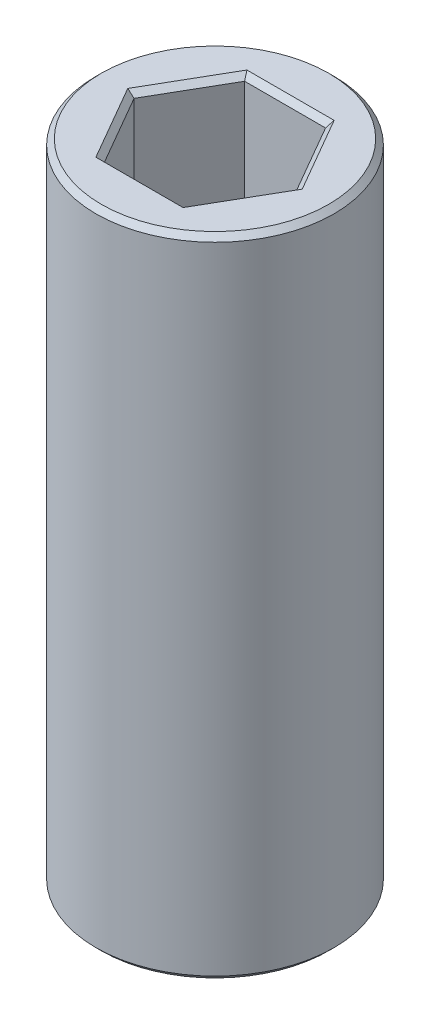
ISO-10303-21;
HEADER;
FILE_DESCRIPTION(('STEP AP214'),'2;1');
FILE_NAME('part.step','',(''),(''),'','','');
FILE_SCHEMA(('AUTOMOTIVE_DESIGN { 1 0 10303 214 1 1 1 1 }'));
ENDSEC;
DATA;
#1=APPLICATION_CONTEXT('core data for automotive mechanical design processes');
#2=APPLICATION_PROTOCOL_DEFINITION('international standard','automotive_design',2000,#1);
#3=PRODUCT_CONTEXT('',#1,'mechanical');
#4=PRODUCT('Part','Part','',(#3));
#5=PRODUCT_RELATED_PRODUCT_CATEGORY('part','',(#4));
#6=PRODUCT_DEFINITION_FORMATION('','',#4);
#7=PRODUCT_DEFINITION_CONTEXT('part definition',#1,'design');
#8=PRODUCT_DEFINITION('design','',#6,#7);
#9=PRODUCT_DEFINITION_SHAPE('','',#8);
#10=(LENGTH_UNIT() NAMED_UNIT(*) SI_UNIT(.MILLI.,.METRE.));
#11=(NAMED_UNIT(*) PLANE_ANGLE_UNIT() SI_UNIT($,.RADIAN.));
#12=(NAMED_UNIT(*) SI_UNIT($,.STERADIAN.) SOLID_ANGLE_UNIT());
#13=UNCERTAINTY_MEASURE_WITH_UNIT(LENGTH_MEASURE(1.E-05),#10,'distance_accuracy_value','');
#14=(GEOMETRIC_REPRESENTATION_CONTEXT(3) GLOBAL_UNCERTAINTY_ASSIGNED_CONTEXT((#13)) GLOBAL_UNIT_ASSIGNED_CONTEXT((#10,
#11,#12)) REPRESENTATION_CONTEXT('',''));
#15=CARTESIAN_POINT('',(0.,0.,0.));
#16=DIRECTION('',(0.,0.,1.));
#17=DIRECTION('',(1.,0.,0.));
#18=AXIS2_PLACEMENT_3D('',#15,#16,#17);
#19=CARTESIAN_POINT('',(0.,60.325,0.));
#20=DIRECTION('',(0.,1.,0.));
#21=DIRECTION('',(0.,0.,1.));
#22=AXIS2_PLACEMENT_3D('',#19,#20,#21);
#23=PLANE('',#22);
#24=CARTESIAN_POINT('',(0.,60.325,0.));
#25=DIRECTION('',(0.,1.,0.));
#26=DIRECTION('',(0.,0.,1.));
#27=AXIS2_PLACEMENT_3D('',#24,#25,#26);
#28=CIRCLE('',#27,10.6045);
#29=CARTESIAN_POINT('',(0.,60.325,10.6045));
#30=VERTEX_POINT('',#29);
#31=EDGE_CURVE('E11',#30,#30,#28,.T.);
#32=ORIENTED_EDGE('',*,*,#31,.T.);
#33=EDGE_LOOP('',(#32));
#34=FACE_BOUND('',#33,.T.);
#35=DIRECTION('',(-1.,0.,0.));
#36=VECTOR('',#35,1.);
#37=CARTESIAN_POINT('',(0.,60.325,7.0485));
#38=LINE('',#37,#36);
#39=CARTESIAN_POINT('',(4.06945337238308,60.325,7.0485));
#40=VERTEX_POINT('',#39);
#41=CARTESIAN_POINT('',(-4.06945337238308,60.325,7.04850000000001));
#42=VERTEX_POINT('',#41);
#43=EDGE_CURVE('E62',#40,#42,#38,.T.);
#44=ORIENTED_EDGE('',*,*,#43,.T.);
#45=DIRECTION('',(-0.5,0.,-0.866025403784439));
#46=VECTOR('',#45,1.);
#47=CARTESIAN_POINT('',(-6.10418005857462,60.325,3.52425));
#48=LINE('',#47,#46);
#49=CARTESIAN_POINT('',(-8.13890674476616,60.325,0.));
#50=VERTEX_POINT('',#49);
#51=EDGE_CURVE('E54',#42,#50,#48,.T.);
#52=ORIENTED_EDGE('',*,*,#51,.T.);
#53=DIRECTION('',(0.499999999999999,0.,-0.866025403784439));
#54=VECTOR('',#53,1.);
#55=CARTESIAN_POINT('',(-6.10418005857462,60.325,-3.52425));
#56=LINE('',#55,#54);
#57=CARTESIAN_POINT('',(-4.06945337238308,60.325,-7.0485));
#58=VERTEX_POINT('',#57);
#59=EDGE_CURVE('E230',#50,#58,#56,.T.);
#60=ORIENTED_EDGE('',*,*,#59,.T.);
#61=DIRECTION('',(1.,0.,0.));
#62=VECTOR('',#61,1.);
#63=CARTESIAN_POINT('',(0.,60.325,-7.0485));
#64=LINE('',#63,#62);
#65=CARTESIAN_POINT('',(4.06945337238308,60.325,-7.0485));
#66=VERTEX_POINT('',#65);
#67=EDGE_CURVE('E233',#58,#66,#64,.T.);
#68=ORIENTED_EDGE('',*,*,#67,.T.);
#69=DIRECTION('',(0.5,0.,0.866025403784439));
#70=VECTOR('',#69,1.);
#71=CARTESIAN_POINT('',(6.10418005857462,60.325,-3.52425));
#72=LINE('',#71,#70);
#73=CARTESIAN_POINT('',(8.13890674476616,60.325,0.));
#74=VERTEX_POINT('',#73);
#75=EDGE_CURVE('E236',#66,#74,#72,.T.);
#76=ORIENTED_EDGE('',*,*,#75,.T.);
#77=DIRECTION('',(-0.499999999999999,0.,0.866025403784439));
#78=VECTOR('',#77,1.);
#79=CARTESIAN_POINT('',(6.10418005857462,60.325,3.52425));
#80=LINE('',#79,#78);
#81=EDGE_CURVE('E67',#74,#40,#80,.T.);
#82=ORIENTED_EDGE('',*,*,#81,.T.);
#83=EDGE_LOOP('',(#44,#52,#60,#68,#76,#82));
#84=FACE_BOUND('',#83,.T.);
#85=ADVANCED_FACE('F43',(#34,#84),#23,.T.);
#86=CARTESIAN_POINT('',(0.,0.,0.));
#87=DIRECTION('',(0.,1.,0.));
#88=DIRECTION('',(0.,0.,1.));
#89=AXIS2_PLACEMENT_3D('',#86,#87,#88);
#90=PLANE('',#89);
#91=DIRECTION('',(-1.,0.,0.));
#92=VECTOR('',#91,1.);
#93=CARTESIAN_POINT('',(-3.77615943563475,0.,-7.0485));
#94=LINE('',#93,#92);
#95=CARTESIAN_POINT('',(4.06945337238308,0.,-7.0485));
#96=VERTEX_POINT('',#95);
#97=CARTESIAN_POINT('',(-4.06945337238308,0.,-7.0485));
#98=VERTEX_POINT('',#97);
#99=EDGE_CURVE('E141',#96,#98,#94,.T.);
#100=ORIENTED_EDGE('',*,*,#99,.T.);
#101=DIRECTION('',(-0.499999999999999,0.,0.866025403784439));
#102=VECTOR('',#101,1.);
#103=CARTESIAN_POINT('',(-7.99225977639199,0.,-0.253999999999998));
#104=LINE('',#103,#102);
#105=CARTESIAN_POINT('',(-8.13890674476615,0.,0.));
#106=VERTEX_POINT('',#105);
#107=EDGE_CURVE('E182',#98,#106,#104,.T.);
#108=ORIENTED_EDGE('',*,*,#107,.T.);
#109=DIRECTION('',(0.5,0.,0.866025403784439));
#110=VECTOR('',#109,1.);
#111=CARTESIAN_POINT('',(-4.21610034075724,0.,6.7945));
#112=LINE('',#111,#110);
#113=CARTESIAN_POINT('',(-4.06945337238307,0.,7.0485));
#114=VERTEX_POINT('',#113);
#115=EDGE_CURVE('E179',#106,#114,#112,.T.);
#116=ORIENTED_EDGE('',*,*,#115,.T.);
#117=DIRECTION('',(1.,0.,0.));
#118=VECTOR('',#117,1.);
#119=CARTESIAN_POINT('',(3.77615943563475,0.,7.0485));
#120=LINE('',#119,#118);
#121=CARTESIAN_POINT('',(4.06945337238308,0.,7.0485));
#122=VERTEX_POINT('',#121);
#123=EDGE_CURVE('E176',#114,#122,#120,.T.);
#124=ORIENTED_EDGE('',*,*,#123,.T.);
#125=DIRECTION('',(0.499999999999999,0.,-0.866025403784439));
#126=VECTOR('',#125,1.);
#127=CARTESIAN_POINT('',(7.99225977639199,0.,0.253999999999997));
#128=LINE('',#127,#126);
#129=CARTESIAN_POINT('',(8.13890674476615,0.,0.));
#130=VERTEX_POINT('',#129);
#131=EDGE_CURVE('E144',#122,#130,#128,.T.);
#132=ORIENTED_EDGE('',*,*,#131,.T.);
#133=DIRECTION('',(-0.5,0.,-0.866025403784439));
#134=VECTOR('',#133,1.);
#135=CARTESIAN_POINT('',(4.21610034075724,0.,-6.7945));
#136=LINE('',#135,#134);
#137=EDGE_CURVE('E135',#130,#96,#136,.T.);
#138=ORIENTED_EDGE('',*,*,#137,.T.);
#139=EDGE_LOOP('',(#100,#108,#116,#124,#132,#138));
#140=FACE_BOUND('',#139,.T.);
#141=CARTESIAN_POINT('',(0.,0.,0.));
#142=DIRECTION('',(0.,1.,0.));
#143=DIRECTION('',(0.,0.,1.));
#144=AXIS2_PLACEMENT_3D('',#141,#142,#143);
#145=CIRCLE('',#144,10.6044999999999);
#146=CARTESIAN_POINT('',(0.,0.,10.6044999999999));
#147=VERTEX_POINT('',#146);
#148=EDGE_CURVE('E165',#147,#147,#145,.F.);
#149=ORIENTED_EDGE('',*,*,#148,.T.);
#150=EDGE_LOOP('',(#149));
#151=FACE_BOUND('',#150,.T.);
#152=ADVANCED_FACE('F137',(#140,#151),#90,.F.);
#153=CARTESIAN_POINT('',(0.,60.325,0.));
#154=DIRECTION('',(0.,-1.,0.));
#155=DIRECTION('',(0.,0.,-1.));
#156=AXIS2_PLACEMENT_3D('',#153,#154,#155);
#157=CYLINDRICAL_SURFACE('',#156,11.1125);
#158=CARTESIAN_POINT('',(0.,0.50800000000005,0.));
#159=DIRECTION('',(0.,1.,0.));
#160=DIRECTION('',(0.,0.,1.));
#161=AXIS2_PLACEMENT_3D('',#158,#159,#160);
#162=CIRCLE('',#161,11.1125);
#163=CARTESIAN_POINT('',(0.,0.50800000000005,-11.1125));
#164=VERTEX_POINT('',#163);
#165=EDGE_CURVE('E226',#164,#164,#162,.T.);
#166=CARTESIAN_POINT('',(0.,59.817,0.));
#167=DIRECTION('',(0.,1.,0.));
#168=DIRECTION('',(0.,0.,1.));
#169=AXIS2_PLACEMENT_3D('',#166,#167,#168);
#170=CIRCLE('',#169,11.1125);
#171=CARTESIAN_POINT('',(0.,59.817,-11.1125));
#172=VERTEX_POINT('',#171);
#173=EDGE_CURVE('E222',#172,#172,#170,.F.);
#174=CARTESIAN_POINT('',(0.,0.50800000000005,-11.1125));
#175=CARTESIAN_POINT('',(0.,1.12580208333338,-11.1125));
#176=CARTESIAN_POINT('',(0.,1.74360416666672,-11.1125));
#177=CARTESIAN_POINT('',(0.,2.97920833333338,-11.1125));
#178=CARTESIAN_POINT('',(0.,3.59701041666671,-11.1125));
#179=CARTESIAN_POINT('',(0.,4.83261458333338,-11.1125));
#180=CARTESIAN_POINT('',(0.,5.45041666666671,-11.1125));
#181=CARTESIAN_POINT('',(0.,6.68602083333338,-11.1125));
#182=CARTESIAN_POINT('',(0.,7.30382291666671,-11.1125));
#183=CARTESIAN_POINT('',(0.,8.53942708333338,-11.1125));
#184=CARTESIAN_POINT('',(0.,9.15722916666671,-11.1125));
#185=CARTESIAN_POINT('',(0.,10.3928333333334,-11.1125));
#186=CARTESIAN_POINT('',(0.,11.0106354166667,-11.1125));
#187=CARTESIAN_POINT('',(0.,12.2462395833334,-11.1125));
#188=CARTESIAN_POINT('',(0.,12.8640416666667,-11.1125));
#189=CARTESIAN_POINT('',(0.,14.0996458333334,-11.1125));
#190=CARTESIAN_POINT('',(0.,14.7174479166667,-11.1125));
#191=CARTESIAN_POINT('',(0.,15.9530520833334,-11.1125));
#192=CARTESIAN_POINT('',(0.,16.5708541666667,-11.1125));
#193=CARTESIAN_POINT('',(0.,17.8064583333334,-11.1125));
#194=CARTESIAN_POINT('',(0.,18.4242604166667,-11.1125));
#195=CARTESIAN_POINT('',(0.,19.6598645833334,-11.1125));
#196=CARTESIAN_POINT('',(0.,20.2776666666667,-11.1125));
#197=CARTESIAN_POINT('',(0.,21.5132708333334,-11.1125));
#198=CARTESIAN_POINT('',(0.,22.1310729166667,-11.1125));
#199=CARTESIAN_POINT('',(0.,23.3666770833334,-11.1125));
#200=CARTESIAN_POINT('',(0.,23.9844791666667,-11.1125));
#201=CARTESIAN_POINT('',(0.,25.2200833333334,-11.1125));
#202=CARTESIAN_POINT('',(0.,25.8378854166667,-11.1125));
#203=CARTESIAN_POINT('',(0.,27.0734895833334,-11.1125));
#204=CARTESIAN_POINT('',(0.,27.6912916666667,-11.1125));
#205=CARTESIAN_POINT('',(0.,28.9268958333334,-11.1125));
#206=CARTESIAN_POINT('',(0.,29.5446979166667,-11.1125));
#207=CARTESIAN_POINT('',(0.,30.7803020833334,-11.1125));
#208=CARTESIAN_POINT('',(0.,31.3981041666667,-11.1125));
#209=CARTESIAN_POINT('',(0.,32.6337083333334,-11.1125));
#210=CARTESIAN_POINT('',(0.,33.2515104166667,-11.1125));
#211=CARTESIAN_POINT('',(0.,34.4871145833334,-11.1125));
#212=CARTESIAN_POINT('',(0.,35.1049166666667,-11.1125));
#213=CARTESIAN_POINT('',(0.,36.3405208333334,-11.1125));
#214=CARTESIAN_POINT('',(0.,36.9583229166667,-11.1125));
#215=CARTESIAN_POINT('',(0.,38.1939270833334,-11.1125));
#216=CARTESIAN_POINT('',(0.,38.8117291666667,-11.1125));
#217=CARTESIAN_POINT('',(0.,40.0473333333334,-11.1125));
#218=CARTESIAN_POINT('',(0.,40.6651354166667,-11.1125));
#219=CARTESIAN_POINT('',(0.,41.9007395833334,-11.1125));
#220=CARTESIAN_POINT('',(0.,42.5185416666667,-11.1125));
#221=CARTESIAN_POINT('',(0.,43.7541458333334,-11.1125));
#222=CARTESIAN_POINT('',(0.,44.3719479166667,-11.1125));
#223=CARTESIAN_POINT('',(0.,45.6075520833334,-11.1125));
#224=CARTESIAN_POINT('',(0.,46.2253541666667,-11.1125));
#225=CARTESIAN_POINT('',(0.,47.4609583333334,-11.1125));
#226=CARTESIAN_POINT('',(0.,48.0787604166667,-11.1125));
#227=CARTESIAN_POINT('',(0.,49.3143645833334,-11.1125));
#228=CARTESIAN_POINT('',(0.,49.9321666666667,-11.1125));
#229=CARTESIAN_POINT('',(0.,51.1677708333334,-11.1125));
#230=CARTESIAN_POINT('',(0.,51.7855729166667,-11.1125));
#231=CARTESIAN_POINT('',(0.,53.0211770833334,-11.1125));
#232=CARTESIAN_POINT('',(0.,53.6389791666667,-11.1125));
#233=CARTESIAN_POINT('',(0.,54.8745833333334,-11.1125));
#234=CARTESIAN_POINT('',(0.,55.4923854166667,-11.1125));
#235=CARTESIAN_POINT('',(0.,56.7279895833334,-11.1125));
#236=CARTESIAN_POINT('',(0.,57.3457916666667,-11.1125));
#237=CARTESIAN_POINT('',(0.,58.5813958333333,-11.1125));
#238=CARTESIAN_POINT('',(0.,59.1991979166667,-11.1125));
#239=CARTESIAN_POINT('',(0.,59.817,-11.1125));
#240=B_SPLINE_CURVE_WITH_KNOTS('',3,(#174,#175,#176,#177,#178,#179,#180,#181,#182,#183,#184,
#185,#186,#187,#188,#189,#190,#191,#192,#193,#194,#195,#196,#197,#198,#199,#200,#201,#202,#203,
#204,#205,#206,#207,#208,#209,#210,#211,#212,#213,#214,#215,#216,#217,#218,#219,#220,#221,#222,
#223,#224,#225,#226,#227,#228,#229,#230,#231,#232,#233,#234,#235,#236,#237,#238,#239),
.UNSPECIFIED.,.F.,.F.,(4,2,2,2,2,2,2,2,2,2,2,2,2,2,2,2,2,2,2,2,2,2,2,2,2,2,2,2,2,2,2,2,4),(0.,
1.85340625,3.7068125,5.56021875,7.41362499999999,9.26703125,11.1204375,12.97384375,14.82725,
16.68065625,18.5340625,20.38746875,22.240875,24.09428125,25.9476875,27.80109375,29.6545,
31.50790625,33.3613125,35.21471875,37.068125,38.92153125,40.7749375,42.62834375,44.48175,
46.33515625,48.1885625,50.04196875,51.895375,53.74878125,55.6021875,57.45559375,59.309),.UNSPECIFIED.);
#241=EDGE_CURVE('BSEAM375',#164,#172,#240,.T.);
#242=ORIENTED_EDGE('',*,*,#165,.T.);
#243=ORIENTED_EDGE('',*,*,#173,.T.);
#244=ORIENTED_EDGE('',*,*,#241,.T.);
#245=ORIENTED_EDGE('',*,*,#241,.F.);
#246=EDGE_LOOP('',(#242,#244,#243,#245));
#247=FACE_BOUND('',#246,.T.);
#248=ADVANCED_FACE('F375',(#247),#157,.T.);
#249=CARTESIAN_POINT('',(3.77615943563475,60.325,6.5405));
#250=DIRECTION('',(-0.866025403784439,0.,-0.499999999999999));
#251=DIRECTION('',(-0.499999999999999,0.,0.866025403784439));
#252=AXIS2_PLACEMENT_3D('',#249,#250,#251);
#253=PLANE('',#252);
#254=DIRECTION('',(0.,-1.,0.));
#255=VECTOR('',#254,1.);
#256=CARTESIAN_POINT('',(7.55231887126949,60.325,0.));
#257=LINE('',#256,#255);
#258=CARTESIAN_POINT('',(7.55231887126949,59.817,0.));
#259=VERTEX_POINT('',#258);
#260=CARTESIAN_POINT('',(7.55231887126949,0.508000000000015,0.));
#261=VERTEX_POINT('',#260);
#262=EDGE_CURVE('E170',#259,#261,#257,.T.);
#263=ORIENTED_EDGE('',*,*,#262,.T.);
#264=DIRECTION('',(-0.499999999999999,0.,0.866025403784439));
#265=VECTOR('',#264,1.);
#266=CARTESIAN_POINT('',(3.77615943563475,0.508000000000001,6.5405));
#267=LINE('',#266,#265);
#268=CARTESIAN_POINT('',(3.77615943563475,0.508000000000015,6.5405));
#269=VERTEX_POINT('',#268);
#270=EDGE_CURVE('E208',#261,#269,#267,.T.);
#271=ORIENTED_EDGE('',*,*,#270,.T.);
#272=DIRECTION('',(0.,-1.,0.));
#273=VECTOR('',#272,1.);
#274=CARTESIAN_POINT('',(3.77615943563475,60.325,6.5405));
#275=LINE('',#274,#273);
#276=CARTESIAN_POINT('',(3.77615943563475,59.817,6.5405));
#277=VERTEX_POINT('',#276);
#278=EDGE_CURVE('E259',#277,#269,#275,.T.);
#279=ORIENTED_EDGE('',*,*,#278,.F.);
#280=DIRECTION('',(0.499999999999999,0.,-0.866025403784439));
#281=VECTOR('',#280,1.);
#282=CARTESIAN_POINT('',(3.77615943563475,59.817,6.5405));
#283=LINE('',#282,#281);
#284=EDGE_CURVE('E205',#277,#259,#283,.T.);
#285=ORIENTED_EDGE('',*,*,#284,.T.);
#286=EDGE_LOOP('',(#263,#271,#279,#285));
#287=FACE_BOUND('',#286,.T.);
#288=ADVANCED_FACE('F331',(#287),#253,.T.);
#289=CARTESIAN_POINT('',(7.55231887126949,60.325,0.));
#290=DIRECTION('',(-0.866025403784438,0.,0.5));
#291=DIRECTION('',(0.5,0.,0.866025403784438));
#292=AXIS2_PLACEMENT_3D('',#289,#290,#291);
#293=PLANE('',#292);
#294=DIRECTION('',(0.,-1.,0.));
#295=VECTOR('',#294,1.);
#296=CARTESIAN_POINT('',(3.77615943563474,60.325,-6.5405));
#297=LINE('',#296,#295);
#298=CARTESIAN_POINT('',(3.77615943563474,59.817,-6.5405));
#299=VERTEX_POINT('',#298);
#300=CARTESIAN_POINT('',(3.77615943563474,0.508000000000015,-6.5405));
#301=VERTEX_POINT('',#300);
#302=EDGE_CURVE('E318',#299,#301,#297,.T.);
#303=ORIENTED_EDGE('',*,*,#302,.T.);
#304=DIRECTION('',(0.5,0.,0.866025403784438));
#305=VECTOR('',#304,1.);
#306=CARTESIAN_POINT('',(7.55231887126949,0.508000000000002,0.));
#307=LINE('',#306,#305);
#308=EDGE_CURVE('E154',#301,#261,#307,.T.);
#309=ORIENTED_EDGE('',*,*,#308,.T.);
#310=ORIENTED_EDGE('',*,*,#262,.F.);
#311=DIRECTION('',(-0.5,0.,-0.866025403784438));
#312=VECTOR('',#311,1.);
#313=CARTESIAN_POINT('',(7.55231887126949,59.817,0.));
#314=LINE('',#313,#312);
#315=EDGE_CURVE('E211',#259,#299,#314,.T.);
#316=ORIENTED_EDGE('',*,*,#315,.T.);
#317=EDGE_LOOP('',(#303,#309,#310,#316));
#318=FACE_BOUND('',#317,.T.);
#319=ADVANCED_FACE('F556',(#318),#293,.T.);
#320=CARTESIAN_POINT('',(3.77615943563474,60.325,-6.5405));
#321=DIRECTION('',(0.,0.,1.));
#322=DIRECTION('',(1.,0.,0.));
#323=AXIS2_PLACEMENT_3D('',#320,#321,#322);
#324=PLANE('',#323);
#325=DIRECTION('',(0.,-1.,0.));
#326=VECTOR('',#325,1.);
#327=CARTESIAN_POINT('',(-3.77615943563475,60.325,-6.5405));
#328=LINE('',#327,#326);
#329=CARTESIAN_POINT('',(-3.77615943563475,59.817,-6.5405));
#330=VERTEX_POINT('',#329);
#331=CARTESIAN_POINT('',(-3.77615943563475,0.508000000000015,-6.5405));
#332=VERTEX_POINT('',#331);
#333=EDGE_CURVE('E306',#330,#332,#328,.T.);
#334=ORIENTED_EDGE('',*,*,#333,.T.);
#335=DIRECTION('',(1.,0.,0.));
#336=VECTOR('',#335,1.);
#337=CARTESIAN_POINT('',(3.77615943563474,0.508000000000002,-6.5405));
#338=LINE('',#337,#336);
#339=EDGE_CURVE('E219',#332,#301,#338,.T.);
#340=ORIENTED_EDGE('',*,*,#339,.T.);
#341=ORIENTED_EDGE('',*,*,#302,.F.);
#342=DIRECTION('',(-1.,0.,0.));
#343=VECTOR('',#342,1.);
#344=CARTESIAN_POINT('',(3.77615943563474,59.817,-6.5405));
#345=LINE('',#344,#343);
#346=EDGE_CURVE('E216',#299,#330,#345,.T.);
#347=ORIENTED_EDGE('',*,*,#346,.T.);
#348=EDGE_LOOP('',(#334,#340,#341,#347));
#349=FACE_BOUND('',#348,.T.);
#350=ADVANCED_FACE('F548',(#349),#324,.T.);
#351=CARTESIAN_POINT('',(-3.77615943563475,60.325,-6.5405));
#352=DIRECTION('',(0.866025403784439,0.,0.499999999999999));
#353=DIRECTION('',(0.499999999999999,0.,-0.866025403784439));
#354=AXIS2_PLACEMENT_3D('',#351,#352,#353);
#355=PLANE('',#354);
#356=DIRECTION('',(0.,-1.,0.));
#357=VECTOR('',#356,1.);
#358=CARTESIAN_POINT('',(-7.55231887126949,60.325,0.));
#359=LINE('',#358,#357);
#360=CARTESIAN_POINT('',(-7.55231887126949,59.817,0.));
#361=VERTEX_POINT('',#360);
#362=CARTESIAN_POINT('',(-7.55231887126949,0.508000000000015,0.));
#363=VERTEX_POINT('',#362);
#364=EDGE_CURVE('E303',#361,#363,#359,.T.);
#365=ORIENTED_EDGE('',*,*,#364,.T.);
#366=DIRECTION('',(0.499999999999999,0.,-0.866025403784439));
#367=VECTOR('',#366,1.);
#368=CARTESIAN_POINT('',(-3.77615943563475,0.508000000000002,-6.5405));
#369=LINE('',#368,#367);
#370=EDGE_CURVE('E188',#363,#332,#369,.T.);
#371=ORIENTED_EDGE('',*,*,#370,.T.);
#372=ORIENTED_EDGE('',*,*,#333,.F.);
#373=DIRECTION('',(-0.499999999999999,0.,0.866025403784439));
#374=VECTOR('',#373,1.);
#375=CARTESIAN_POINT('',(-3.77615943563475,59.817,-6.5405));
#376=LINE('',#375,#374);
#377=EDGE_CURVE('E185',#330,#361,#376,.T.);
#378=ORIENTED_EDGE('',*,*,#377,.T.);
#379=EDGE_LOOP('',(#365,#371,#372,#378));
#380=FACE_BOUND('',#379,.T.);
#381=ADVANCED_FACE('F302',(#380),#355,.T.);
#382=CARTESIAN_POINT('',(-7.55231887126949,60.325,0.));
#383=DIRECTION('',(0.866025403784439,0.,-0.5));
#384=DIRECTION('',(-0.5,0.,-0.866025403784439));
#385=AXIS2_PLACEMENT_3D('',#382,#383,#384);
#386=PLANE('',#385);
#387=DIRECTION('',(0.,-1.,0.));
#388=VECTOR('',#387,1.);
#389=CARTESIAN_POINT('',(-3.77615943563474,60.325,6.5405));
#390=LINE('',#389,#388);
#391=CARTESIAN_POINT('',(-3.77615943563474,59.817,6.5405));
#392=VERTEX_POINT('',#391);
#393=CARTESIAN_POINT('',(-3.77615943563474,0.508000000000015,6.5405));
#394=VERTEX_POINT('',#393);
#395=EDGE_CURVE('E313',#392,#394,#390,.T.);
#396=ORIENTED_EDGE('',*,*,#395,.T.);
#397=DIRECTION('',(-0.5,0.,-0.866025403784439));
#398=VECTOR('',#397,1.);
#399=CARTESIAN_POINT('',(-7.55231887126949,0.508000000000002,0.));
#400=LINE('',#399,#398);
#401=EDGE_CURVE('E196',#394,#363,#400,.T.);
#402=ORIENTED_EDGE('',*,*,#401,.T.);
#403=ORIENTED_EDGE('',*,*,#364,.F.);
#404=DIRECTION('',(0.5,0.,0.866025403784439));
#405=VECTOR('',#404,1.);
#406=CARTESIAN_POINT('',(-7.55231887126949,59.817,0.));
#407=LINE('',#406,#405);
#408=EDGE_CURVE('E192',#361,#392,#407,.T.);
#409=ORIENTED_EDGE('',*,*,#408,.T.);
#410=EDGE_LOOP('',(#396,#402,#403,#409));
#411=FACE_BOUND('',#410,.T.);
#412=ADVANCED_FACE('F309',(#411),#386,.T.);
#413=CARTESIAN_POINT('',(-3.77615943563474,60.325,6.5405));
#414=DIRECTION('',(0.,0.,-1.));
#415=DIRECTION('',(-1.,0.,0.));
#416=AXIS2_PLACEMENT_3D('',#413,#414,#415);
#417=PLANE('',#416);
#418=ORIENTED_EDGE('',*,*,#278,.T.);
#419=DIRECTION('',(-1.,0.,0.));
#420=VECTOR('',#419,1.);
#421=CARTESIAN_POINT('',(-3.77615943563474,0.508000000000002,6.5405));
#422=LINE('',#421,#420);
#423=EDGE_CURVE('E202',#269,#394,#422,.T.);
#424=ORIENTED_EDGE('',*,*,#423,.T.);
#425=ORIENTED_EDGE('',*,*,#395,.F.);
#426=DIRECTION('',(1.,0.,0.));
#427=VECTOR('',#426,1.);
#428=CARTESIAN_POINT('',(-3.77615943563474,59.817,6.5405));
#429=LINE('',#428,#427);
#430=EDGE_CURVE('E199',#392,#277,#429,.T.);
#431=ORIENTED_EDGE('',*,*,#430,.T.);
#432=EDGE_LOOP('',(#418,#424,#425,#431));
#433=FACE_BOUND('',#432,.T.);
#434=ADVANCED_FACE('F344',(#433),#417,.T.);
#435=CARTESIAN_POINT('',(6.10418005857462,0.,3.52425));
#436=DIRECTION('',(-0.612372435695794,-0.707106781186549,-0.353553390593273));
#437=DIRECTION('',(-0.499999999999999,0.,0.866025403784439));
#438=AXIS2_PLACEMENT_3D('',#435,#436,#437);
#439=PLANE('',#438);
#440=DIRECTION('',(-0.37796447300923,0.654653670707976,-0.654653670707976));
#441=VECTOR('',#440,1.);
#442=CARTESIAN_POINT('',(3.48810289061406,1.00692857142858,6.04157142857143));
#443=LINE('',#442,#441);
#444=EDGE_CURVE('E158',#269,#122,#443,.F.);
#445=ORIENTED_EDGE('',*,*,#444,.F.);
#446=ORIENTED_EDGE('',*,*,#270,.F.);
#447=DIRECTION('',(-0.755928946018455,0.654653670707976,0.));
#448=VECTOR('',#447,1.);
#449=CARTESIAN_POINT('',(6.97620578122814,1.00692857142857,0.));
#450=LINE('',#449,#448);
#451=EDGE_CURVE('E256',#130,#261,#450,.T.);
#452=ORIENTED_EDGE('',*,*,#451,.F.);
#453=ORIENTED_EDGE('',*,*,#131,.F.);
#454=EDGE_LOOP('',(#445,#446,#452,#453));
#455=FACE_BOUND('',#454,.T.);
#456=ADVANCED_FACE('F337',(#455),#439,.T.);
#457=CARTESIAN_POINT('',(6.10418005857462,0.,-3.52425));
#458=DIRECTION('',(-0.612372435695794,-0.707106781186548,0.353553390593274));
#459=DIRECTION('',(0.5,0.,0.866025403784438));
#460=AXIS2_PLACEMENT_3D('',#457,#458,#459);
#461=PLANE('',#460);
#462=ORIENTED_EDGE('',*,*,#451,.T.);
#463=ORIENTED_EDGE('',*,*,#308,.F.);
#464=DIRECTION('',(-0.377964473009228,0.654653670707977,0.654653670707977));
#465=VECTOR('',#464,1.);
#466=CARTESIAN_POINT('',(3.48810289061407,1.00692857142857,-6.04157142857143));
#467=LINE('',#466,#465);
#468=EDGE_CURVE('E152',#96,#301,#467,.T.);
#469=ORIENTED_EDGE('',*,*,#468,.F.);
#470=ORIENTED_EDGE('',*,*,#137,.F.);
#471=EDGE_LOOP('',(#462,#463,#469,#470));
#472=FACE_BOUND('',#471,.T.);
#473=ADVANCED_FACE('F153',(#472),#461,.T.);
#474=CARTESIAN_POINT('',(0.,0.,7.0485));
#475=DIRECTION('',(0.,-0.707106781186547,-0.707106781186547));
#476=DIRECTION('',(-1.,0.,0.));
#477=AXIS2_PLACEMENT_3D('',#474,#475,#476);
#478=PLANE('',#477);
#479=ORIENTED_EDGE('',*,*,#444,.T.);
#480=ORIENTED_EDGE('',*,*,#123,.F.);
#481=DIRECTION('',(0.377964473009228,0.654653670707977,-0.654653670707977));
#482=VECTOR('',#481,1.);
#483=CARTESIAN_POINT('',(-3.48810289061406,1.00692857142857,6.04157142857143));
#484=LINE('',#483,#482);
#485=EDGE_CURVE('E159',#394,#114,#484,.F.);
#486=ORIENTED_EDGE('',*,*,#485,.F.);
#487=ORIENTED_EDGE('',*,*,#423,.F.);
#488=EDGE_LOOP('',(#479,#480,#486,#487));
#489=FACE_BOUND('',#488,.T.);
#490=ADVANCED_FACE('F342',(#489),#478,.T.);
#491=CARTESIAN_POINT('',(0.,0.,-7.0485));
#492=DIRECTION('',(0.,-0.707106781186547,0.707106781186548));
#493=DIRECTION('',(1.,0.,0.));
#494=AXIS2_PLACEMENT_3D('',#491,#492,#493);
#495=PLANE('',#494);
#496=ORIENTED_EDGE('',*,*,#468,.T.);
#497=ORIENTED_EDGE('',*,*,#339,.F.);
#498=DIRECTION('',(-0.377964473009229,-0.654653670707977,-0.654653670707977));
#499=VECTOR('',#498,1.);
#500=CARTESIAN_POINT('',(-3.48810289061407,1.00692857142857,-6.04157142857143));
#501=LINE('',#500,#499);
#502=EDGE_CURVE('E162',#98,#332,#501,.F.);
#503=ORIENTED_EDGE('',*,*,#502,.F.);
#504=ORIENTED_EDGE('',*,*,#99,.F.);
#505=EDGE_LOOP('',(#496,#497,#503,#504));
#506=FACE_BOUND('',#505,.T.);
#507=ADVANCED_FACE('F161',(#506),#495,.T.);
#508=CARTESIAN_POINT('',(-6.10418005857461,0.,3.52425));
#509=DIRECTION('',(0.612372435695794,-0.707106781186548,-0.353553390593274));
#510=DIRECTION('',(-0.5,0.,-0.866025403784439));
#511=AXIS2_PLACEMENT_3D('',#508,#509,#510);
#512=PLANE('',#511);
#513=ORIENTED_EDGE('',*,*,#485,.T.);
#514=ORIENTED_EDGE('',*,*,#115,.F.);
#515=DIRECTION('',(0.755928946018455,0.654653670707977,0.));
#516=VECTOR('',#515,1.);
#517=CARTESIAN_POINT('',(-6.97620578122813,1.00692857142857,0.));
#518=LINE('',#517,#516);
#519=EDGE_CURVE('E245',#363,#106,#518,.F.);
#520=ORIENTED_EDGE('',*,*,#519,.F.);
#521=ORIENTED_EDGE('',*,*,#401,.F.);
#522=EDGE_LOOP('',(#513,#514,#520,#521));
#523=FACE_BOUND('',#522,.T.);
#524=ADVANCED_FACE('F392',(#523),#512,.T.);
#525=CARTESIAN_POINT('',(-6.10418005857462,0.,-3.52425));
#526=DIRECTION('',(0.612372435695794,-0.707106781186548,0.353553390593273));
#527=DIRECTION('',(0.499999999999999,0.,-0.866025403784439));
#528=AXIS2_PLACEMENT_3D('',#525,#526,#527);
#529=PLANE('',#528);
#530=ORIENTED_EDGE('',*,*,#502,.T.);
#531=ORIENTED_EDGE('',*,*,#370,.F.);
#532=ORIENTED_EDGE('',*,*,#519,.T.);
#533=ORIENTED_EDGE('',*,*,#107,.F.);
#534=EDGE_LOOP('',(#530,#531,#532,#533));
#535=FACE_BOUND('',#534,.T.);
#536=ADVANCED_FACE('F384',(#535),#529,.T.);
#537=CARTESIAN_POINT('',(0.,0.50800000000005,0.));
#538=DIRECTION('',(0.,1.,0.));
#539=DIRECTION('',(0.,0.,1.));
#540=AXIS2_PLACEMENT_3D('',#537,#538,#539);
#541=CONICAL_SURFACE('',#540,11.1125,0.785398163397452);
#542=ORIENTED_EDGE('',*,*,#148,.F.);
#543=EDGE_LOOP('',(#542));
#544=FACE_BOUND('',#543,.T.);
#545=ORIENTED_EDGE('',*,*,#165,.F.);
#546=EDGE_LOOP('',(#545));
#547=FACE_BOUND('',#546,.T.);
#548=ADVANCED_FACE('F391',(#544,#547),#541,.T.);
#549=CARTESIAN_POINT('',(0.,60.325,0.));
#550=DIRECTION('',(0.,-1.,0.));
#551=DIRECTION('',(0.,0.,-1.));
#552=AXIS2_PLACEMENT_3D('',#549,#550,#551);
#553=CONICAL_SURFACE('',#552,10.6045,0.785398163397445);
#554=ORIENTED_EDGE('',*,*,#173,.F.);
#555=EDGE_LOOP('',(#554));
#556=FACE_BOUND('',#555,.T.);
#557=ORIENTED_EDGE('',*,*,#31,.F.);
#558=EDGE_LOOP('',(#557));
#559=FACE_BOUND('',#558,.T.);
#560=ADVANCED_FACE('F423',(#556,#559),#553,.T.);
#561=CARTESIAN_POINT('',(7.55231887126949,59.817,0.));
#562=DIRECTION('',(0.612372435695797,-0.707106781186544,-0.353553390593276));
#563=DIRECTION('',(-0.5,0.,-0.866025403784438));
#564=AXIS2_PLACEMENT_3D('',#561,#562,#563);
#565=PLANE('',#564);
#566=DIRECTION('',(0.755928946018451,0.654653670707981,0.));
#567=VECTOR('',#566,1.);
#568=CARTESIAN_POINT('',(5.39451347947822,57.9482857142857,0.));
#569=LINE('',#568,#567);
#570=EDGE_CURVE('E273',#74,#259,#569,.F.);
#571=ORIENTED_EDGE('',*,*,#570,.F.);
#572=ORIENTED_EDGE('',*,*,#75,.F.);
#573=DIRECTION('',(0.377964473009227,0.654653670707981,-0.654653670707973));
#574=VECTOR('',#573,1.);
#575=CARTESIAN_POINT('',(2.69725673973911,57.9482857142857,-4.67178571428575));
#576=LINE('',#575,#574);
#577=EDGE_CURVE('E48',#299,#66,#576,.T.);
#578=ORIENTED_EDGE('',*,*,#577,.F.);
#579=ORIENTED_EDGE('',*,*,#315,.F.);
#580=EDGE_LOOP('',(#571,#572,#578,#579));
#581=FACE_BOUND('',#580,.T.);
#582=ADVANCED_FACE('F46',(#581),#565,.F.);
#583=CARTESIAN_POINT('',(3.77615943563474,59.817,-6.5405));
#584=DIRECTION('',(0.,-0.707106781186543,-0.707106781186552));
#585=DIRECTION('',(-1.,0.,0.));
#586=AXIS2_PLACEMENT_3D('',#583,#584,#585);
#587=PLANE('',#586);
#588=ORIENTED_EDGE('',*,*,#577,.T.);
#589=ORIENTED_EDGE('',*,*,#67,.F.);
#590=DIRECTION('',(-0.377964473009228,0.654653670707981,-0.654653670707973));
#591=VECTOR('',#590,1.);
#592=CARTESIAN_POINT('',(-2.6972567397391,57.9482857142857,-4.67178571428572));
#593=LINE('',#592,#591);
#594=EDGE_CURVE('E270',#330,#58,#593,.T.);
#595=ORIENTED_EDGE('',*,*,#594,.F.);
#596=ORIENTED_EDGE('',*,*,#346,.F.);
#597=EDGE_LOOP('',(#588,#589,#595,#596));
#598=FACE_BOUND('',#597,.T.);
#599=ADVANCED_FACE('F287',(#598),#587,.F.);
#600=CARTESIAN_POINT('',(3.77615943563475,59.817,6.5405));
#601=DIRECTION('',(0.612372435695798,-0.707106781186544,0.353553390593275));
#602=DIRECTION('',(0.499999999999999,0.,-0.866025403784439));
#603=AXIS2_PLACEMENT_3D('',#600,#601,#602);
#604=PLANE('',#603);
#605=ORIENTED_EDGE('',*,*,#570,.T.);
#606=ORIENTED_EDGE('',*,*,#284,.F.);
#607=DIRECTION('',(0.377964473009227,0.654653670707981,0.654653670707973));
#608=VECTOR('',#607,1.);
#609=CARTESIAN_POINT('',(2.69725673973911,57.9482857142857,4.67178571428573));
#610=LINE('',#609,#608);
#611=EDGE_CURVE('E266',#40,#277,#610,.F.);
#612=ORIENTED_EDGE('',*,*,#611,.F.);
#613=ORIENTED_EDGE('',*,*,#81,.F.);
#614=EDGE_LOOP('',(#605,#606,#612,#613));
#615=FACE_BOUND('',#614,.T.);
#616=ADVANCED_FACE('F355',(#615),#604,.F.);
#617=CARTESIAN_POINT('',(-3.77615943563475,59.817,-6.5405));
#618=DIRECTION('',(-0.612372435695798,-0.707106781186544,-0.353553390593275));
#619=DIRECTION('',(-0.499999999999999,0.,0.866025403784439));
#620=AXIS2_PLACEMENT_3D('',#617,#618,#619);
#621=PLANE('',#620);
#622=ORIENTED_EDGE('',*,*,#594,.T.);
#623=ORIENTED_EDGE('',*,*,#59,.F.);
#624=DIRECTION('',(0.755928946018452,-0.654653670707981,0.));
#625=VECTOR('',#624,1.);
#626=CARTESIAN_POINT('',(-7.55231887126949,59.817,0.));
#627=LINE('',#626,#625);
#628=EDGE_CURVE('E263',#361,#50,#627,.F.);
#629=ORIENTED_EDGE('',*,*,#628,.F.);
#630=ORIENTED_EDGE('',*,*,#377,.F.);
#631=EDGE_LOOP('',(#622,#623,#629,#630));
#632=FACE_BOUND('',#631,.T.);
#633=ADVANCED_FACE('F295',(#632),#621,.F.);
#634=CARTESIAN_POINT('',(-3.77615943563474,59.817,6.5405));
#635=DIRECTION('',(0.,-0.707106781186543,0.707106781186552));
#636=DIRECTION('',(1.,0.,0.));
#637=AXIS2_PLACEMENT_3D('',#634,#635,#636);
#638=PLANE('',#637);
#639=ORIENTED_EDGE('',*,*,#611,.T.);
#640=ORIENTED_EDGE('',*,*,#430,.F.);
#641=DIRECTION('',(-0.377964473009228,0.654653670707981,0.654653670707973));
#642=VECTOR('',#641,1.);
#643=CARTESIAN_POINT('',(-2.69725673973911,57.9482857142857,4.67178571428575));
#644=LINE('',#643,#642);
#645=EDGE_CURVE('E260',#42,#392,#644,.F.);
#646=ORIENTED_EDGE('',*,*,#645,.F.);
#647=ORIENTED_EDGE('',*,*,#43,.F.);
#648=EDGE_LOOP('',(#639,#640,#646,#647));
#649=FACE_BOUND('',#648,.T.);
#650=ADVANCED_FACE('F357',(#649),#638,.F.);
#651=CARTESIAN_POINT('',(-7.55231887126949,59.817,0.));
#652=DIRECTION('',(-0.612372435695797,-0.707106781186545,0.353553390593275));
#653=DIRECTION('',(0.5,0.,0.866025403784439));
#654=AXIS2_PLACEMENT_3D('',#651,#652,#653);
#655=PLANE('',#654);
#656=ORIENTED_EDGE('',*,*,#628,.T.);
#657=ORIENTED_EDGE('',*,*,#51,.F.);
#658=ORIENTED_EDGE('',*,*,#645,.T.);
#659=ORIENTED_EDGE('',*,*,#408,.F.);
#660=EDGE_LOOP('',(#656,#657,#658,#659));
#661=FACE_BOUND('',#660,.T.);
#662=ADVANCED_FACE('F360',(#661),#655,.F.);
#663=CLOSED_SHELL('',(#85,#152,#248,#288,#319,#350,#381,#412,#434,#456,#473,#490,#507,#524,#536,
#548,#560,#582,#599,#616,#633,#650,#662));
#664=MANIFOLD_SOLID_BREP('B2',#663);
#665=ADVANCED_BREP_SHAPE_REPRESENTATION('',(#18,#664),#14);
#666=SHAPE_DEFINITION_REPRESENTATION(#9,#665);
ENDSEC;
END-ISO-10303-21;
